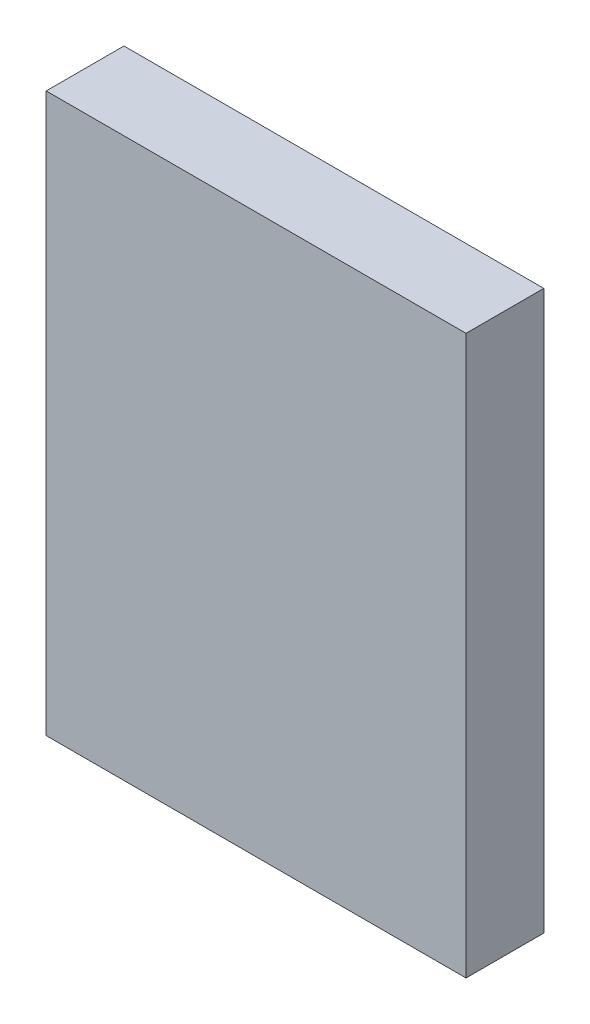
ISO-10303-21;
HEADER;
FILE_DESCRIPTION(('STEP AP214'),'2;1');
FILE_NAME('part.step','',(''),(''),'','','');
FILE_SCHEMA(('AUTOMOTIVE_DESIGN { 1 0 10303 214 1 1 1 1 }'));
ENDSEC;
DATA;
#1=APPLICATION_CONTEXT('core data for automotive mechanical design processes');
#2=APPLICATION_PROTOCOL_DEFINITION('international standard','automotive_design',2000,#1);
#3=PRODUCT_CONTEXT('',#1,'mechanical');
#4=PRODUCT('Part','Part','',(#3));
#5=PRODUCT_RELATED_PRODUCT_CATEGORY('part','',(#4));
#6=PRODUCT_DEFINITION_FORMATION('','',#4);
#7=PRODUCT_DEFINITION_CONTEXT('part definition',#1,'design');
#8=PRODUCT_DEFINITION('design','',#6,#7);
#9=PRODUCT_DEFINITION_SHAPE('','',#8);
#10=(LENGTH_UNIT() NAMED_UNIT(*) SI_UNIT(.MILLI.,.METRE.));
#11=(NAMED_UNIT(*) PLANE_ANGLE_UNIT() SI_UNIT($,.RADIAN.));
#12=(NAMED_UNIT(*) SI_UNIT($,.STERADIAN.) SOLID_ANGLE_UNIT());
#13=UNCERTAINTY_MEASURE_WITH_UNIT(LENGTH_MEASURE(1.E-05),#10,'distance_accuracy_value','');
#14=(GEOMETRIC_REPRESENTATION_CONTEXT(3) GLOBAL_UNCERTAINTY_ASSIGNED_CONTEXT((#13)) GLOBAL_UNIT_ASSIGNED_CONTEXT((#10,
#11,#12)) REPRESENTATION_CONTEXT('',''));
#15=CARTESIAN_POINT('',(0.,0.,0.));
#16=DIRECTION('',(0.,0.,1.));
#17=DIRECTION('',(1.,0.,0.));
#18=AXIS2_PLACEMENT_3D('',#15,#16,#17);
#19=CARTESIAN_POINT('',(179.309527428535,-7.03255892249707E-13,15.));
#20=DIRECTION('',(1.,0.,0.));
#21=DIRECTION('',(0.,1.,0.));
#22=AXIS2_PLACEMENT_3D('',#19,#20,#21);
#23=PLANE('',#22);
#24=DIRECTION('',(0.,0.,-1.));
#25=VECTOR('',#24,1.);
#26=CARTESIAN_POINT('',(179.309527428536,42.3848722358489,2.));
#27=LINE('',#26,#25);
#28=CARTESIAN_POINT('',(179.309527428536,42.3848722358489,2.));
#29=VERTEX_POINT('',#28);
#30=CARTESIAN_POINT('',(179.309527428536,42.3848722358489,0.));
#31=VERTEX_POINT('',#30);
#32=EDGE_CURVE('E232',#29,#31,#27,.T.);
#33=ORIENTED_EDGE('',*,*,#32,.F.);
#34=DIRECTION('',(0.,-1.,0.));
#35=VECTOR('',#34,1.);
#36=CARTESIAN_POINT('',(179.309527428536,42.3848722358489,2.));
#37=LINE('',#36,#35);
#38=CARTESIAN_POINT('',(179.309527428536,29.8619960553377,2.));
#39=VERTEX_POINT('',#38);
#40=EDGE_CURVE('E388',#29,#39,#37,.T.);
#41=ORIENTED_EDGE('',*,*,#40,.T.);
#42=DIRECTION('',(0.,0.,-1.));
#43=VECTOR('',#42,1.);
#44=CARTESIAN_POINT('',(179.309527428536,29.8619960553377,15.));
#45=LINE('',#44,#43);
#46=CARTESIAN_POINT('',(179.309527428536,29.8619960553377,15.));
#47=VERTEX_POINT('',#46);
#48=EDGE_CURVE('E286',#47,#39,#45,.T.);
#49=ORIENTED_EDGE('',*,*,#48,.F.);
#50=DIRECTION('',(0.,-1.,0.));
#51=VECTOR('',#50,1.);
#52=CARTESIAN_POINT('',(179.309527428535,-7.03255892249707E-13,15.));
#53=LINE('',#52,#51);
#54=CARTESIAN_POINT('',(179.309527428536,151.036037203411,15.));
#55=VERTEX_POINT('',#54);
#56=EDGE_CURVE('E270',#55,#47,#53,.T.);
#57=ORIENTED_EDGE('',*,*,#56,.F.);
#58=DIRECTION('',(0.,0.,-1.));
#59=VECTOR('',#58,1.);
#60=CARTESIAN_POINT('',(179.309527428536,151.036037203411,15.));
#61=LINE('',#60,#59);
#62=CARTESIAN_POINT('',(179.309527428536,151.036037203411,0.));
#63=VERTEX_POINT('',#62);
#64=EDGE_CURVE('E271',#55,#63,#61,.T.);
#65=ORIENTED_EDGE('',*,*,#64,.T.);
#66=DIRECTION('',(0.,-1.,0.));
#67=VECTOR('',#66,1.);
#68=CARTESIAN_POINT('',(179.309527428535,-7.03255892249707E-13,0.));
#69=LINE('',#68,#67);
#70=CARTESIAN_POINT('',(179.309527428536,100.884872235849,0.));
#71=VERTEX_POINT('',#70);
#72=EDGE_CURVE('E261',#63,#71,#69,.T.);
#73=ORIENTED_EDGE('',*,*,#72,.T.);
#74=DIRECTION('',(0.,0.,-1.));
#75=VECTOR('',#74,1.);
#76=CARTESIAN_POINT('',(179.309527428536,100.884872235849,2.));
#77=LINE('',#76,#75);
#78=CARTESIAN_POINT('',(179.309527428536,100.884872235849,2.));
#79=VERTEX_POINT('',#78);
#80=EDGE_CURVE('E429',#79,#71,#77,.T.);
#81=ORIENTED_EDGE('',*,*,#80,.F.);
#82=DIRECTION('',(0.,-1.,0.));
#83=VECTOR('',#82,1.);
#84=CARTESIAN_POINT('',(179.309527428536,100.884872235849,2.));
#85=LINE('',#84,#83);
#86=CARTESIAN_POINT('',(179.309527428536,75.8848722358489,2.));
#87=VERTEX_POINT('',#86);
#88=EDGE_CURVE('E399',#79,#87,#85,.T.);
#89=ORIENTED_EDGE('',*,*,#88,.T.);
#90=DIRECTION('',(0.,0.,-1.));
#91=VECTOR('',#90,1.);
#92=CARTESIAN_POINT('',(179.309527428536,75.8848722358489,2.));
#93=LINE('',#92,#91);
#94=CARTESIAN_POINT('',(179.309527428536,75.8848722358489,0.));
#95=VERTEX_POINT('',#94);
#96=EDGE_CURVE('E425',#87,#95,#93,.T.);
#97=ORIENTED_EDGE('',*,*,#96,.T.);
#98=EDGE_CURVE('E498',#95,#31,#69,.T.);
#99=ORIENTED_EDGE('',*,*,#98,.T.);
#100=EDGE_LOOP('',(#33,#41,#49,#57,#65,#73,#81,#89,#97,#99));
#101=FACE_BOUND('',#100,.T.);
#102=ADVANCED_FACE('F45',(#101),#23,.F.);
#103=CARTESIAN_POINT('',(102.160177428536,0.,15.));
#104=DIRECTION('',(1.,0.,0.));
#105=DIRECTION('',(0.,0.,-1.));
#106=AXIS2_PLACEMENT_3D('',#103,#104,#105);
#107=PLANE('',#106);
#108=DIRECTION('',(0.,1.,0.));
#109=VECTOR('',#108,1.);
#110=CARTESIAN_POINT('',(102.160177428536,100.884872235849,2.));
#111=LINE('',#110,#109);
#112=CARTESIAN_POINT('',(102.160177428536,75.8848722358489,2.));
#113=VERTEX_POINT('',#112);
#114=CARTESIAN_POINT('',(102.160177428536,100.884872235849,2.));
#115=VERTEX_POINT('',#114);
#116=EDGE_CURVE('E355',#113,#115,#111,.T.);
#117=ORIENTED_EDGE('',*,*,#116,.T.);
#118=DIRECTION('',(0.,0.,-1.));
#119=VECTOR('',#118,1.);
#120=CARTESIAN_POINT('',(102.160177428536,100.884872235849,2.));
#121=LINE('',#120,#119);
#122=CARTESIAN_POINT('',(102.160177428536,100.884872235849,0.));
#123=VERTEX_POINT('',#122);
#124=EDGE_CURVE('E351',#115,#123,#121,.T.);
#125=ORIENTED_EDGE('',*,*,#124,.T.);
#126=DIRECTION('',(0.,-1.,0.));
#127=VECTOR('',#126,1.);
#128=CARTESIAN_POINT('',(102.160177428536,0.,0.));
#129=LINE('',#128,#127);
#130=CARTESIAN_POINT('',(102.160177428536,126.061456055338,0.));
#131=VERTEX_POINT('',#130);
#132=EDGE_CURVE('E253',#131,#123,#129,.T.);
#133=ORIENTED_EDGE('',*,*,#132,.F.);
#134=DIRECTION('',(0.,0.,-1.));
#135=VECTOR('',#134,1.);
#136=CARTESIAN_POINT('',(102.160177428536,126.061456055338,15.));
#137=LINE('',#136,#135);
#138=CARTESIAN_POINT('',(102.160177428536,126.061456055338,15.));
#139=VERTEX_POINT('',#138);
#140=EDGE_CURVE('E280',#139,#131,#137,.T.);
#141=ORIENTED_EDGE('',*,*,#140,.F.);
#142=DIRECTION('',(0.,-1.,0.));
#143=VECTOR('',#142,1.);
#144=CARTESIAN_POINT('',(102.160177428536,0.,15.));
#145=LINE('',#144,#143);
#146=CARTESIAN_POINT('',(102.160177428536,29.8619960553377,15.));
#147=VERTEX_POINT('',#146);
#148=EDGE_CURVE('E474',#139,#147,#145,.T.);
#149=ORIENTED_EDGE('',*,*,#148,.T.);
#150=DIRECTION('',(0.,0.,-1.));
#151=VECTOR('',#150,1.);
#152=CARTESIAN_POINT('',(102.160177428536,29.8619960553377,15.));
#153=LINE('',#152,#151);
#154=CARTESIAN_POINT('',(102.160177428536,29.8619960553377,2.));
#155=VERTEX_POINT('',#154);
#156=EDGE_CURVE('E283',#147,#155,#153,.T.);
#157=ORIENTED_EDGE('',*,*,#156,.T.);
#158=DIRECTION('',(0.,1.,0.));
#159=VECTOR('',#158,1.);
#160=CARTESIAN_POINT('',(102.160177428536,42.3848722358489,2.));
#161=LINE('',#160,#159);
#162=CARTESIAN_POINT('',(102.160177428536,42.3848722358489,2.));
#163=VERTEX_POINT('',#162);
#164=EDGE_CURVE('E243',#155,#163,#161,.T.);
#165=ORIENTED_EDGE('',*,*,#164,.T.);
#166=DIRECTION('',(0.,0.,-1.));
#167=VECTOR('',#166,1.);
#168=CARTESIAN_POINT('',(102.160177428536,42.3848722358489,2.));
#169=LINE('',#168,#167);
#170=CARTESIAN_POINT('',(102.160177428536,42.3848722358489,0.));
#171=VERTEX_POINT('',#170);
#172=EDGE_CURVE('E224',#163,#171,#169,.T.);
#173=ORIENTED_EDGE('',*,*,#172,.T.);
#174=CARTESIAN_POINT('',(102.160177428536,75.8848722358489,0.));
#175=VERTEX_POINT('',#174);
#176=EDGE_CURVE('E241',#175,#171,#129,.T.);
#177=ORIENTED_EDGE('',*,*,#176,.F.);
#178=DIRECTION('',(0.,0.,-1.));
#179=VECTOR('',#178,1.);
#180=CARTESIAN_POINT('',(102.160177428536,75.8848722358489,2.));
#181=LINE('',#180,#179);
#182=EDGE_CURVE('E348',#113,#175,#181,.T.);
#183=ORIENTED_EDGE('',*,*,#182,.F.);
#184=EDGE_LOOP('',(#117,#125,#133,#141,#149,#157,#165,#173,#177,#183));
#185=FACE_BOUND('',#184,.T.);
#186=ADVANCED_FACE('F239',(#185),#107,.T.);
#187=CARTESIAN_POINT('',(0.,26.8619960553377,15.));
#188=DIRECTION('',(0.,1.,0.));
#189=DIRECTION('',(0.,0.,1.));
#190=AXIS2_PLACEMENT_3D('',#187,#188,#189);
#191=PLANE('',#190);
#192=DIRECTION('',(0.,0.,-1.));
#193=VECTOR('',#192,1.);
#194=CARTESIAN_POINT('',(179.309527428536,26.8619960553377,15.));
#195=LINE('',#194,#193);
#196=CARTESIAN_POINT('',(179.309527428536,26.8619960553377,2.));
#197=VERTEX_POINT('',#196);
#198=CARTESIAN_POINT('',(179.309527428536,26.8619960553377,0.));
#199=VERTEX_POINT('',#198);
#200=EDGE_CURVE('E443',#197,#199,#195,.T.);
#201=ORIENTED_EDGE('',*,*,#200,.F.);
#202=DIRECTION('',(-1.,0.,0.));
#203=VECTOR('',#202,1.);
#204=CARTESIAN_POINT('',(0.,26.8619960553377,2.));
#205=LINE('',#204,#203);
#206=CARTESIAN_POINT('',(187.309527428536,26.8619960553377,2.));
#207=VERTEX_POINT('',#206);
#208=EDGE_CURVE('E11',#207,#197,#205,.T.);
#209=ORIENTED_EDGE('',*,*,#208,.F.);
#210=DIRECTION('',(0.,0.,1.));
#211=VECTOR('',#210,1.);
#212=CARTESIAN_POINT('',(187.309527428536,26.8619960553377,15.));
#213=LINE('',#212,#211);
#214=CARTESIAN_POINT('',(187.309527428536,26.8619960553377,0.));
#215=VERTEX_POINT('',#214);
#216=EDGE_CURVE('E440',#215,#207,#213,.T.);
#217=ORIENTED_EDGE('',*,*,#216,.F.);
#218=DIRECTION('',(1.,0.,0.));
#219=VECTOR('',#218,1.);
#220=CARTESIAN_POINT('',(0.,26.8619960553377,0.));
#221=LINE('',#220,#219);
#222=CARTESIAN_POINT('',(189.309527428536,26.8619960553377,0.));
#223=VERTEX_POINT('',#222);
#224=EDGE_CURVE('E495',#215,#223,#221,.T.);
#225=ORIENTED_EDGE('',*,*,#224,.T.);
#226=DIRECTION('',(0.,0.,-1.));
#227=VECTOR('',#226,1.);
#228=CARTESIAN_POINT('',(189.309527428536,26.8619960553377,15.));
#229=LINE('',#228,#227);
#230=CARTESIAN_POINT('',(189.309527428536,26.8619960553377,18.));
#231=VERTEX_POINT('',#230);
#232=EDGE_CURVE('E291',#231,#223,#229,.T.);
#233=ORIENTED_EDGE('',*,*,#232,.F.);
#234=DIRECTION('',(1.,0.,0.));
#235=VECTOR('',#234,1.);
#236=CARTESIAN_POINT('',(92.1601774285358,26.8619960553377,18.));
#237=LINE('',#236,#235);
#238=CARTESIAN_POINT('',(92.1601774285358,26.8619960553377,18.));
#239=VERTEX_POINT('',#238);
#240=EDGE_CURVE('E454',#239,#231,#237,.T.);
#241=ORIENTED_EDGE('',*,*,#240,.F.);
#242=DIRECTION('',(0.,0.,-1.));
#243=VECTOR('',#242,1.);
#244=CARTESIAN_POINT('',(92.1601774285358,26.8619960553377,15.));
#245=LINE('',#244,#243);
#246=CARTESIAN_POINT('',(92.1601774285358,26.8619960553377,0.));
#247=VERTEX_POINT('',#246);
#248=EDGE_CURVE('E295',#239,#247,#245,.T.);
#249=ORIENTED_EDGE('',*,*,#248,.T.);
#250=CARTESIAN_POINT('',(94.1601774285357,26.8619960553377,0.));
#251=VERTEX_POINT('',#250);
#252=EDGE_CURVE('E496',#247,#251,#221,.T.);
#253=ORIENTED_EDGE('',*,*,#252,.T.);
#254=DIRECTION('',(0.,0.,-1.));
#255=VECTOR('',#254,1.);
#256=CARTESIAN_POINT('',(94.1601774285357,26.8619960553377,15.));
#257=LINE('',#256,#255);
#258=CARTESIAN_POINT('',(94.1601774285357,26.8619960553377,2.));
#259=VERTEX_POINT('',#258);
#260=EDGE_CURVE('E323',#259,#251,#257,.T.);
#261=ORIENTED_EDGE('',*,*,#260,.F.);
#262=DIRECTION('',(1.,0.,0.));
#263=VECTOR('',#262,1.);
#264=CARTESIAN_POINT('',(0.,26.8619960553377,2.));
#265=LINE('',#264,#263);
#266=CARTESIAN_POINT('',(102.160177428536,26.8619960553377,2.));
#267=VERTEX_POINT('',#266);
#268=EDGE_CURVE('E54',#259,#267,#265,.T.);
#269=ORIENTED_EDGE('',*,*,#268,.T.);
#270=DIRECTION('',(0.,0.,1.));
#271=VECTOR('',#270,1.);
#272=CARTESIAN_POINT('',(102.160177428536,26.8619960553377,15.));
#273=LINE('',#272,#271);
#274=CARTESIAN_POINT('',(102.160177428536,26.8619960553377,0.));
#275=VERTEX_POINT('',#274);
#276=EDGE_CURVE('E320',#275,#267,#273,.T.);
#277=ORIENTED_EDGE('',*,*,#276,.F.);
#278=EDGE_CURVE('E499',#275,#199,#221,.T.);
#279=ORIENTED_EDGE('',*,*,#278,.T.);
#280=EDGE_LOOP('',(#201,#209,#217,#225,#233,#241,#249,#253,#261,#269,#277,#279));
#281=FACE_BOUND('',#280,.T.);
#282=ADVANCED_FACE('F318',(#281),#191,.F.);
#283=CARTESIAN_POINT('',(0.,0.,0.));
#284=DIRECTION('',(0.,0.,1.));
#285=DIRECTION('',(1.,0.,0.));
#286=AXIS2_PLACEMENT_3D('',#283,#284,#285);
#287=PLANE('',#286);
#288=DIRECTION('',(-1.,0.,0.));
#289=VECTOR('',#288,1.);
#290=CARTESIAN_POINT('',(102.160177428536,100.884872235849,0.));
#291=LINE('',#290,#289);
#292=CARTESIAN_POINT('',(94.1601774285357,100.884872235849,0.));
#293=VERTEX_POINT('',#292);
#294=EDGE_CURVE('E362',#123,#293,#291,.T.);
#295=ORIENTED_EDGE('',*,*,#294,.T.);
#296=DIRECTION('',(0.,-1.,0.));
#297=VECTOR('',#296,1.);
#298=CARTESIAN_POINT('',(94.1601774285357,100.884872235849,0.));
#299=LINE('',#298,#297);
#300=CARTESIAN_POINT('',(94.1601774285357,75.8848722358489,0.));
#301=VERTEX_POINT('',#300);
#302=EDGE_CURVE('E358',#293,#301,#299,.T.);
#303=ORIENTED_EDGE('',*,*,#302,.T.);
#304=DIRECTION('',(1.,0.,0.));
#305=VECTOR('',#304,1.);
#306=CARTESIAN_POINT('',(102.160177428536,75.8848722358489,0.));
#307=LINE('',#306,#305);
#308=EDGE_CURVE('E251',#301,#175,#307,.T.);
#309=ORIENTED_EDGE('',*,*,#308,.T.);
#310=ORIENTED_EDGE('',*,*,#176,.T.);
#311=DIRECTION('',(-1.,0.,0.));
#312=VECTOR('',#311,1.);
#313=CARTESIAN_POINT('',(102.160177428536,42.3848722358489,0.));
#314=LINE('',#313,#312);
#315=CARTESIAN_POINT('',(94.1601774285357,42.3848722358489,0.));
#316=VERTEX_POINT('',#315);
#317=EDGE_CURVE('E220',#171,#316,#314,.T.);
#318=ORIENTED_EDGE('',*,*,#317,.T.);
#319=DIRECTION('',(0.,-1.,0.));
#320=VECTOR('',#319,1.);
#321=CARTESIAN_POINT('',(94.1601774285357,42.3848722358489,0.));
#322=LINE('',#321,#320);
#323=EDGE_CURVE('E233',#316,#251,#322,.T.);
#324=ORIENTED_EDGE('',*,*,#323,.T.);
#325=ORIENTED_EDGE('',*,*,#252,.F.);
#326=DIRECTION('',(0.,-1.,0.));
#327=VECTOR('',#326,1.);
#328=CARTESIAN_POINT('',(92.1601774285358,0.,0.));
#329=LINE('',#328,#327);
#330=CARTESIAN_POINT('',(92.1601774285357,156.061456055338,0.));
#331=VERTEX_POINT('',#330);
#332=EDGE_CURVE('E492',#331,#247,#329,.T.);
#333=ORIENTED_EDGE('',*,*,#332,.F.);
#334=DIRECTION('',(1.,0.,0.));
#335=VECTOR('',#334,1.);
#336=CARTESIAN_POINT('',(0.,156.061456055338,0.));
#337=LINE('',#336,#335);
#338=CARTESIAN_POINT('',(189.309527428536,156.061456055338,0.));
#339=VERTEX_POINT('',#338);
#340=EDGE_CURVE('E488',#331,#339,#337,.T.);
#341=ORIENTED_EDGE('',*,*,#340,.T.);
#342=DIRECTION('',(0.,-1.,0.));
#343=VECTOR('',#342,1.);
#344=CARTESIAN_POINT('',(189.309527428536,0.,0.));
#345=LINE('',#344,#343);
#346=EDGE_CURVE('E466',#339,#223,#345,.T.);
#347=ORIENTED_EDGE('',*,*,#346,.T.);
#348=ORIENTED_EDGE('',*,*,#224,.F.);
#349=DIRECTION('',(0.,-1.,0.));
#350=VECTOR('',#349,1.);
#351=CARTESIAN_POINT('',(187.309527428536,0.,0.));
#352=LINE('',#351,#350);
#353=CARTESIAN_POINT('',(187.309527428536,42.3848722358489,0.));
#354=VERTEX_POINT('',#353);
#355=EDGE_CURVE('E307',#354,#215,#352,.T.);
#356=ORIENTED_EDGE('',*,*,#355,.F.);
#357=DIRECTION('',(-1.,0.,0.));
#358=VECTOR('',#357,1.);
#359=CARTESIAN_POINT('',(179.309527428536,42.3848722358489,0.));
#360=LINE('',#359,#358);
#361=EDGE_CURVE('E61',#354,#31,#360,.T.);
#362=ORIENTED_EDGE('',*,*,#361,.T.);
#363=ORIENTED_EDGE('',*,*,#98,.F.);
#364=DIRECTION('',(1.,0.,0.));
#365=VECTOR('',#364,1.);
#366=CARTESIAN_POINT('',(179.309527428536,75.8848722358489,0.));
#367=LINE('',#366,#365);
#368=CARTESIAN_POINT('',(187.309527428536,75.8848722358489,0.));
#369=VERTEX_POINT('',#368);
#370=EDGE_CURVE('E413',#95,#369,#367,.T.);
#371=ORIENTED_EDGE('',*,*,#370,.T.);
#372=DIRECTION('',(0.,1.,0.));
#373=VECTOR('',#372,1.);
#374=CARTESIAN_POINT('',(187.309527428536,100.884872235849,0.));
#375=LINE('',#374,#373);
#376=CARTESIAN_POINT('',(187.309527428536,100.884872235849,0.));
#377=VERTEX_POINT('',#376);
#378=EDGE_CURVE('E400',#369,#377,#375,.T.);
#379=ORIENTED_EDGE('',*,*,#378,.T.);
#380=DIRECTION('',(-1.,0.,0.));
#381=VECTOR('',#380,1.);
#382=CARTESIAN_POINT('',(179.309527428536,100.884872235849,0.));
#383=LINE('',#382,#381);
#384=EDGE_CURVE('E69',#377,#71,#383,.T.);
#385=ORIENTED_EDGE('',*,*,#384,.T.);
#386=ORIENTED_EDGE('',*,*,#72,.F.);
#387=DIRECTION('',(1.,0.,0.));
#388=VECTOR('',#387,1.);
#389=CARTESIAN_POINT('',(1.08710511562201E-13,151.036037203411,0.));
#390=LINE('',#389,#388);
#391=CARTESIAN_POINT('',(102.185575180632,151.036037203411,0.));
#392=VERTEX_POINT('',#391);
#393=EDGE_CURVE('E267',#392,#63,#390,.T.);
#394=ORIENTED_EDGE('',*,*,#393,.F.);
#395=DIRECTION('',(0.00101694354001441,0.999999482912785,0.));
#396=VECTOR('',#395,1.);
#397=CARTESIAN_POINT('',(102.031874460029,-0.103760709261023,0.));
#398=LINE('',#397,#396);
#399=EDGE_CURVE('E259',#131,#392,#398,.T.);
#400=ORIENTED_EDGE('',*,*,#399,.F.);
#401=ORIENTED_EDGE('',*,*,#132,.T.);
#402=EDGE_LOOP('',(#295,#303,#309,#310,#318,#324,#325,#333,#341,#347,#348,#356,#362,#363,#371,
#379,#385,#386,#394,#400,#401));
#403=FACE_BOUND('',#402,.T.);
#404=ADVANCED_FACE('F248',(#403),#287,.F.);
#405=DIRECTION('',(0.,1.,0.));
#406=VECTOR('',#405,1.);
#407=CARTESIAN_POINT('',(179.309527428535,-7.96294263543264E-13,0.));
#408=LINE('',#407,#406);
#409=CARTESIAN_POINT('',(179.309527428536,29.8619960553377,0.));
#410=VERTEX_POINT('',#409);
#411=EDGE_CURVE('E310',#199,#410,#408,.T.);
#412=ORIENTED_EDGE('',*,*,#411,.F.);
#413=ORIENTED_EDGE('',*,*,#278,.F.);
#414=DIRECTION('',(0.,-1.,0.));
#415=VECTOR('',#414,1.);
#416=CARTESIAN_POINT('',(102.160177428536,4.53682324723806E-13,0.));
#417=LINE('',#416,#415);
#418=CARTESIAN_POINT('',(102.160177428536,29.8619960553377,0.));
#419=VERTEX_POINT('',#418);
#420=EDGE_CURVE('E290',#419,#275,#417,.T.);
#421=ORIENTED_EDGE('',*,*,#420,.F.);
#422=DIRECTION('',(1.,0.,0.));
#423=VECTOR('',#422,1.);
#424=CARTESIAN_POINT('',(0.,29.8619960553378,0.));
#425=LINE('',#424,#423);
#426=EDGE_CURVE('E254',#419,#410,#425,.T.);
#427=ORIENTED_EDGE('',*,*,#426,.T.);
#428=EDGE_LOOP('',(#412,#413,#421,#427));
#429=FACE_BOUND('',#428,.T.);
#430=ADVANCED_FACE('F583',(#429),#287,.F.);
#431=CARTESIAN_POINT('',(0.,29.8619960553378,15.));
#432=DIRECTION('',(0.,1.,0.));
#433=DIRECTION('',(-1.,0.,0.));
#434=AXIS2_PLACEMENT_3D('',#431,#432,#433);
#435=PLANE('',#434);
#436=ORIENTED_EDGE('',*,*,#426,.F.);
#437=DIRECTION('',(0.,0.,1.));
#438=VECTOR('',#437,1.);
#439=CARTESIAN_POINT('',(102.160177428536,29.8619960553377,15.));
#440=LINE('',#439,#438);
#441=EDGE_CURVE('E434',#419,#155,#440,.T.);
#442=ORIENTED_EDGE('',*,*,#441,.T.);
#443=ORIENTED_EDGE('',*,*,#156,.F.);
#444=DIRECTION('',(1.,0.,0.));
#445=VECTOR('',#444,1.);
#446=CARTESIAN_POINT('',(0.,29.8619960553378,15.));
#447=LINE('',#446,#445);
#448=EDGE_CURVE('E470',#147,#47,#447,.T.);
#449=ORIENTED_EDGE('',*,*,#448,.T.);
#450=ORIENTED_EDGE('',*,*,#48,.T.);
#451=DIRECTION('',(0.,0.,-1.));
#452=VECTOR('',#451,1.);
#453=CARTESIAN_POINT('',(179.309527428536,29.8619960553377,15.));
#454=LINE('',#453,#452);
#455=EDGE_CURVE('E446',#39,#410,#454,.T.);
#456=ORIENTED_EDGE('',*,*,#455,.T.);
#457=EDGE_LOOP('',(#436,#442,#443,#449,#450,#456));
#458=FACE_BOUND('',#457,.T.);
#459=ADVANCED_FACE('F566',(#458),#435,.T.);
#460=CARTESIAN_POINT('',(102.031874460029,-0.103760709261023,15.));
#461=DIRECTION('',(-0.999999482912785,0.00101694354001441,0.));
#462=DIRECTION('',(-0.00101694354001441,-0.999999482912785,0.));
#463=AXIS2_PLACEMENT_3D('',#460,#461,#462);
#464=PLANE('',#463);
#465=ORIENTED_EDGE('',*,*,#399,.T.);
#466=DIRECTION('',(0.,0.,-1.));
#467=VECTOR('',#466,1.);
#468=CARTESIAN_POINT('',(102.185575180632,151.036037203411,15.));
#469=LINE('',#468,#467);
#470=CARTESIAN_POINT('',(102.185575180632,151.036037203411,15.));
#471=VERTEX_POINT('',#470);
#472=EDGE_CURVE('E275',#471,#392,#469,.T.);
#473=ORIENTED_EDGE('',*,*,#472,.F.);
#474=DIRECTION('',(0.00101694354001441,0.999999482912785,0.));
#475=VECTOR('',#474,1.);
#476=CARTESIAN_POINT('',(102.031874460029,-0.103760709261023,15.));
#477=LINE('',#476,#475);
#478=EDGE_CURVE('E478',#139,#471,#477,.T.);
#479=ORIENTED_EDGE('',*,*,#478,.F.);
#480=ORIENTED_EDGE('',*,*,#140,.T.);
#481=EDGE_LOOP('',(#465,#473,#479,#480));
#482=FACE_BOUND('',#481,.T.);
#483=ADVANCED_FACE('F574',(#482),#464,.F.);
#484=CARTESIAN_POINT('',(189.309527428536,0.,15.));
#485=DIRECTION('',(1.,0.,0.));
#486=DIRECTION('',(0.,0.,-1.));
#487=AXIS2_PLACEMENT_3D('',#484,#485,#486);
#488=PLANE('',#487);
#489=ORIENTED_EDGE('',*,*,#346,.F.);
#490=DIRECTION('',(0.,0.,-1.));
#491=VECTOR('',#490,1.);
#492=CARTESIAN_POINT('',(189.309527428536,156.061456055338,15.));
#493=LINE('',#492,#491);
#494=CARTESIAN_POINT('',(189.309527428536,156.061456055338,18.));
#495=VERTEX_POINT('',#494);
#496=EDGE_CURVE('E276',#495,#339,#493,.T.);
#497=ORIENTED_EDGE('',*,*,#496,.F.);
#498=DIRECTION('',(0.,1.,0.));
#499=VECTOR('',#498,1.);
#500=CARTESIAN_POINT('',(189.309527428536,156.061456055338,18.));
#501=LINE('',#500,#499);
#502=EDGE_CURVE('E458',#231,#495,#501,.T.);
#503=ORIENTED_EDGE('',*,*,#502,.F.);
#504=ORIENTED_EDGE('',*,*,#232,.T.);
#505=EDGE_LOOP('',(#489,#497,#503,#504));
#506=FACE_BOUND('',#505,.T.);
#507=ADVANCED_FACE('F47',(#506),#488,.T.);
#508=CARTESIAN_POINT('',(0.,156.061456055338,15.));
#509=DIRECTION('',(0.,1.,0.));
#510=DIRECTION('',(0.,0.,1.));
#511=AXIS2_PLACEMENT_3D('',#508,#509,#510);
#512=PLANE('',#511);
#513=ORIENTED_EDGE('',*,*,#340,.F.);
#514=DIRECTION('',(0.,0.,-1.));
#515=VECTOR('',#514,1.);
#516=CARTESIAN_POINT('',(92.1601774285357,156.061456055338,15.));
#517=LINE('',#516,#515);
#518=CARTESIAN_POINT('',(92.1601774285357,156.061456055338,18.));
#519=VERTEX_POINT('',#518);
#520=EDGE_CURVE('E300',#519,#331,#517,.T.);
#521=ORIENTED_EDGE('',*,*,#520,.F.);
#522=DIRECTION('',(-1.,0.,0.));
#523=VECTOR('',#522,1.);
#524=CARTESIAN_POINT('',(92.1601774285357,156.061456055338,18.));
#525=LINE('',#524,#523);
#526=EDGE_CURVE('E462',#495,#519,#525,.T.);
#527=ORIENTED_EDGE('',*,*,#526,.F.);
#528=ORIENTED_EDGE('',*,*,#496,.T.);
#529=EDGE_LOOP('',(#513,#521,#527,#528));
#530=FACE_BOUND('',#529,.T.);
#531=ADVANCED_FACE('F538',(#530),#512,.T.);
#532=CARTESIAN_POINT('',(92.1601774285358,0.,15.));
#533=DIRECTION('',(1.,0.,0.));
#534=DIRECTION('',(0.,1.,0.));
#535=AXIS2_PLACEMENT_3D('',#532,#533,#534);
#536=PLANE('',#535);
#537=ORIENTED_EDGE('',*,*,#332,.T.);
#538=ORIENTED_EDGE('',*,*,#248,.F.);
#539=DIRECTION('',(0.,-1.,0.));
#540=VECTOR('',#539,1.);
#541=CARTESIAN_POINT('',(92.1601774285357,156.061456055338,18.));
#542=LINE('',#541,#540);
#543=EDGE_CURVE('E450',#519,#239,#542,.T.);
#544=ORIENTED_EDGE('',*,*,#543,.F.);
#545=ORIENTED_EDGE('',*,*,#520,.T.);
#546=EDGE_LOOP('',(#537,#538,#544,#545));
#547=FACE_BOUND('',#546,.T.);
#548=ADVANCED_FACE('F535',(#547),#536,.F.);
#549=CARTESIAN_POINT('',(1.08710511562201E-13,151.036037203411,15.));
#550=DIRECTION('',(0.,1.,0.));
#551=DIRECTION('',(-1.,0.,0.));
#552=AXIS2_PLACEMENT_3D('',#549,#550,#551);
#553=PLANE('',#552);
#554=ORIENTED_EDGE('',*,*,#393,.T.);
#555=ORIENTED_EDGE('',*,*,#64,.F.);
#556=DIRECTION('',(1.,0.,0.));
#557=VECTOR('',#556,1.);
#558=CARTESIAN_POINT('',(1.08710511562201E-13,151.036037203411,15.));
#559=LINE('',#558,#557);
#560=EDGE_CURVE('E296',#471,#55,#559,.T.);
#561=ORIENTED_EDGE('',*,*,#560,.F.);
#562=ORIENTED_EDGE('',*,*,#472,.T.);
#563=EDGE_LOOP('',(#554,#555,#561,#562));
#564=FACE_BOUND('',#563,.T.);
#565=ADVANCED_FACE('F555',(#564),#553,.F.);
#566=CARTESIAN_POINT('',(0.,0.,15.));
#567=DIRECTION('',(0.,0.,1.));
#568=DIRECTION('',(1.,0.,0.));
#569=AXIS2_PLACEMENT_3D('',#566,#567,#568);
#570=PLANE('',#569);
#571=ORIENTED_EDGE('',*,*,#560,.T.);
#572=ORIENTED_EDGE('',*,*,#56,.T.);
#573=ORIENTED_EDGE('',*,*,#448,.F.);
#574=ORIENTED_EDGE('',*,*,#148,.F.);
#575=ORIENTED_EDGE('',*,*,#478,.T.);
#576=EDGE_LOOP('',(#571,#572,#573,#574,#575));
#577=FACE_BOUND('',#576,.T.);
#578=ADVANCED_FACE('F547',(#577),#570,.F.);
#579=CARTESIAN_POINT('',(0.,0.,18.));
#580=DIRECTION('',(0.,0.,1.));
#581=DIRECTION('',(1.,0.,0.));
#582=AXIS2_PLACEMENT_3D('',#579,#580,#581);
#583=PLANE('',#582);
#584=ORIENTED_EDGE('',*,*,#543,.T.);
#585=ORIENTED_EDGE('',*,*,#240,.T.);
#586=ORIENTED_EDGE('',*,*,#502,.T.);
#587=ORIENTED_EDGE('',*,*,#526,.T.);
#588=EDGE_LOOP('',(#584,#585,#586,#587));
#589=FACE_BOUND('',#588,.T.);
#590=ADVANCED_FACE('F544',(#589),#583,.T.);
#591=CARTESIAN_POINT('',(179.309527428536,100.884872235849,2.));
#592=DIRECTION('',(0.,-1.,0.));
#593=DIRECTION('',(0.,0.,-1.));
#594=AXIS2_PLACEMENT_3D('',#591,#592,#593);
#595=PLANE('',#594);
#596=ORIENTED_EDGE('',*,*,#384,.F.);
#597=DIRECTION('',(0.,0.,-1.));
#598=VECTOR('',#597,1.);
#599=CARTESIAN_POINT('',(187.309527428536,100.884872235849,2.));
#600=LINE('',#599,#598);
#601=CARTESIAN_POINT('',(187.309527428536,100.884872235849,2.));
#602=VERTEX_POINT('',#601);
#603=EDGE_CURVE('E410',#602,#377,#600,.T.);
#604=ORIENTED_EDGE('',*,*,#603,.F.);
#605=DIRECTION('',(-1.,0.,0.));
#606=VECTOR('',#605,1.);
#607=CARTESIAN_POINT('',(179.309527428536,100.884872235849,2.));
#608=LINE('',#607,#606);
#609=EDGE_CURVE('E395',#602,#79,#608,.T.);
#610=ORIENTED_EDGE('',*,*,#609,.T.);
#611=ORIENTED_EDGE('',*,*,#80,.T.);
#612=EDGE_LOOP('',(#596,#604,#610,#611));
#613=FACE_BOUND('',#612,.T.);
#614=ADVANCED_FACE('F546',(#613),#595,.T.);
#615=CARTESIAN_POINT('',(179.309527428536,75.8848722358489,2.));
#616=DIRECTION('',(0.,1.,0.));
#617=DIRECTION('',(0.,0.,1.));
#618=AXIS2_PLACEMENT_3D('',#615,#616,#617);
#619=PLANE('',#618);
#620=ORIENTED_EDGE('',*,*,#370,.F.);
#621=ORIENTED_EDGE('',*,*,#96,.F.);
#622=DIRECTION('',(1.,0.,0.));
#623=VECTOR('',#622,1.);
#624=CARTESIAN_POINT('',(179.309527428536,75.8848722358489,2.));
#625=LINE('',#624,#623);
#626=CARTESIAN_POINT('',(187.309527428536,75.8848722358489,2.));
#627=VERTEX_POINT('',#626);
#628=EDGE_CURVE('E404',#87,#627,#625,.T.);
#629=ORIENTED_EDGE('',*,*,#628,.T.);
#630=DIRECTION('',(0.,0.,-1.));
#631=VECTOR('',#630,1.);
#632=CARTESIAN_POINT('',(187.309527428536,75.8848722358489,2.));
#633=LINE('',#632,#631);
#634=EDGE_CURVE('E422',#627,#369,#633,.T.);
#635=ORIENTED_EDGE('',*,*,#634,.T.);
#636=EDGE_LOOP('',(#620,#621,#629,#635));
#637=FACE_BOUND('',#636,.T.);
#638=ADVANCED_FACE('F553',(#637),#619,.T.);
#639=CARTESIAN_POINT('',(187.309527428536,100.884872235849,2.));
#640=DIRECTION('',(-1.,0.,0.));
#641=DIRECTION('',(0.,0.,1.));
#642=AXIS2_PLACEMENT_3D('',#639,#640,#641);
#643=PLANE('',#642);
#644=ORIENTED_EDGE('',*,*,#378,.F.);
#645=ORIENTED_EDGE('',*,*,#634,.F.);
#646=DIRECTION('',(0.,1.,0.));
#647=VECTOR('',#646,1.);
#648=CARTESIAN_POINT('',(187.309527428536,100.884872235849,2.));
#649=LINE('',#648,#647);
#650=EDGE_CURVE('E407',#627,#602,#649,.T.);
#651=ORIENTED_EDGE('',*,*,#650,.T.);
#652=ORIENTED_EDGE('',*,*,#603,.T.);
#653=EDGE_LOOP('',(#644,#645,#651,#652));
#654=FACE_BOUND('',#653,.T.);
#655=ADVANCED_FACE('F625',(#654),#643,.T.);
#656=CARTESIAN_POINT('',(0.,0.,2.));
#657=DIRECTION('',(0.,0.,-1.));
#658=DIRECTION('',(-1.,0.,0.));
#659=AXIS2_PLACEMENT_3D('',#656,#657,#658);
#660=PLANE('',#659);
#661=ORIENTED_EDGE('',*,*,#609,.F.);
#662=ORIENTED_EDGE('',*,*,#650,.F.);
#663=ORIENTED_EDGE('',*,*,#628,.F.);
#664=ORIENTED_EDGE('',*,*,#88,.F.);
#665=EDGE_LOOP('',(#661,#662,#663,#664));
#666=FACE_BOUND('',#665,.T.);
#667=ADVANCED_FACE('F622',(#666),#660,.T.);
#668=CARTESIAN_POINT('',(0.,0.,2.));
#669=DIRECTION('',(0.,0.,1.));
#670=DIRECTION('',(1.,0.,0.));
#671=AXIS2_PLACEMENT_3D('',#668,#669,#670);
#672=PLANE('',#671);
#673=DIRECTION('',(0.,-1.,0.));
#674=VECTOR('',#673,1.);
#675=CARTESIAN_POINT('',(94.1601774285357,42.3848722358489,2.));
#676=LINE('',#675,#674);
#677=CARTESIAN_POINT('',(94.1601774285357,42.3848722358489,2.));
#678=VERTEX_POINT('',#677);
#679=EDGE_CURVE('E328',#678,#259,#676,.T.);
#680=ORIENTED_EDGE('',*,*,#679,.F.);
#681=DIRECTION('',(-1.,0.,0.));
#682=VECTOR('',#681,1.);
#683=CARTESIAN_POINT('',(102.160177428536,42.3848722358489,2.));
#684=LINE('',#683,#682);
#685=EDGE_CURVE('E334',#163,#678,#684,.T.);
#686=ORIENTED_EDGE('',*,*,#685,.F.);
#687=ORIENTED_EDGE('',*,*,#164,.F.);
#688=EDGE_CURVE('E330',#267,#155,#161,.T.);
#689=ORIENTED_EDGE('',*,*,#688,.F.);
#690=ORIENTED_EDGE('',*,*,#268,.F.);
#691=EDGE_LOOP('',(#680,#686,#687,#689,#690));
#692=FACE_BOUND('',#691,.T.);
#693=ADVANCED_FACE('F327',(#692),#672,.F.);
#694=CARTESIAN_POINT('',(94.1601774285357,42.3848722358489,2.));
#695=DIRECTION('',(1.,0.,0.));
#696=DIRECTION('',(0.,0.,-1.));
#697=AXIS2_PLACEMENT_3D('',#694,#695,#696);
#698=PLANE('',#697);
#699=ORIENTED_EDGE('',*,*,#260,.T.);
#700=ORIENTED_EDGE('',*,*,#323,.F.);
#701=DIRECTION('',(0.,0.,-1.));
#702=VECTOR('',#701,1.);
#703=CARTESIAN_POINT('',(94.1601774285357,42.3848722358489,2.));
#704=LINE('',#703,#702);
#705=EDGE_CURVE('E227',#678,#316,#704,.T.);
#706=ORIENTED_EDGE('',*,*,#705,.F.);
#707=ORIENTED_EDGE('',*,*,#679,.T.);
#708=EDGE_LOOP('',(#699,#700,#706,#707));
#709=FACE_BOUND('',#708,.T.);
#710=ADVANCED_FACE('F332',(#709),#698,.T.);
#711=CARTESIAN_POINT('',(102.160177428536,42.3848722358489,2.));
#712=DIRECTION('',(-1.,0.,0.));
#713=DIRECTION('',(0.,-1.,0.));
#714=AXIS2_PLACEMENT_3D('',#711,#712,#713);
#715=PLANE('',#714);
#716=ORIENTED_EDGE('',*,*,#420,.T.);
#717=ORIENTED_EDGE('',*,*,#276,.T.);
#718=ORIENTED_EDGE('',*,*,#688,.T.);
#719=ORIENTED_EDGE('',*,*,#441,.F.);
#720=EDGE_LOOP('',(#716,#717,#718,#719));
#721=FACE_BOUND('',#720,.T.);
#722=ADVANCED_FACE('F664',(#721),#715,.T.);
#723=CARTESIAN_POINT('',(102.160177428536,42.3848722358489,2.));
#724=DIRECTION('',(0.,-1.,0.));
#725=DIRECTION('',(1.,0.,0.));
#726=AXIS2_PLACEMENT_3D('',#723,#724,#725);
#727=PLANE('',#726);
#728=ORIENTED_EDGE('',*,*,#317,.F.);
#729=ORIENTED_EDGE('',*,*,#172,.F.);
#730=ORIENTED_EDGE('',*,*,#685,.T.);
#731=ORIENTED_EDGE('',*,*,#705,.T.);
#732=EDGE_LOOP('',(#728,#729,#730,#731));
#733=FACE_BOUND('',#732,.T.);
#734=ADVANCED_FACE('F222',(#733),#727,.T.);
#735=CARTESIAN_POINT('',(0.,0.,2.));
#736=DIRECTION('',(0.,0.,-1.));
#737=DIRECTION('',(-1.,0.,0.));
#738=AXIS2_PLACEMENT_3D('',#735,#736,#737);
#739=PLANE('',#738);
#740=ORIENTED_EDGE('',*,*,#208,.T.);
#741=EDGE_CURVE('E387',#39,#197,#37,.T.);
#742=ORIENTED_EDGE('',*,*,#741,.F.);
#743=ORIENTED_EDGE('',*,*,#40,.F.);
#744=DIRECTION('',(-1.,0.,0.));
#745=VECTOR('',#744,1.);
#746=CARTESIAN_POINT('',(179.309527428536,42.3848722358489,2.));
#747=LINE('',#746,#745);
#748=CARTESIAN_POINT('',(187.309527428536,42.3848722358489,2.));
#749=VERTEX_POINT('',#748);
#750=EDGE_CURVE('E384',#749,#29,#747,.T.);
#751=ORIENTED_EDGE('',*,*,#750,.F.);
#752=DIRECTION('',(0.,1.,0.));
#753=VECTOR('',#752,1.);
#754=CARTESIAN_POINT('',(187.309527428536,42.3848722358489,2.));
#755=LINE('',#754,#753);
#756=EDGE_CURVE('E381',#207,#749,#755,.T.);
#757=ORIENTED_EDGE('',*,*,#756,.F.);
#758=EDGE_LOOP('',(#740,#742,#743,#751,#757));
#759=FACE_BOUND('',#758,.T.);
#760=ADVANCED_FACE('F519',(#759),#739,.T.);
#761=CARTESIAN_POINT('',(179.309527428536,42.3848722358489,2.));
#762=DIRECTION('',(1.,0.,0.));
#763=DIRECTION('',(0.,1.,0.));
#764=AXIS2_PLACEMENT_3D('',#761,#762,#763);
#765=PLANE('',#764);
#766=ORIENTED_EDGE('',*,*,#741,.T.);
#767=ORIENTED_EDGE('',*,*,#200,.T.);
#768=ORIENTED_EDGE('',*,*,#411,.T.);
#769=ORIENTED_EDGE('',*,*,#455,.F.);
#770=EDGE_LOOP('',(#766,#767,#768,#769));
#771=FACE_BOUND('',#770,.T.);
#772=ADVANCED_FACE('F522',(#771),#765,.T.);
#773=CARTESIAN_POINT('',(187.309527428536,42.3848722358489,2.));
#774=DIRECTION('',(-1.,0.,0.));
#775=DIRECTION('',(0.,0.,1.));
#776=AXIS2_PLACEMENT_3D('',#773,#774,#775);
#777=PLANE('',#776);
#778=ORIENTED_EDGE('',*,*,#216,.T.);
#779=ORIENTED_EDGE('',*,*,#756,.T.);
#780=DIRECTION('',(0.,0.,-1.));
#781=VECTOR('',#780,1.);
#782=CARTESIAN_POINT('',(187.309527428536,42.3848722358489,2.));
#783=LINE('',#782,#781);
#784=EDGE_CURVE('E378',#749,#354,#783,.T.);
#785=ORIENTED_EDGE('',*,*,#784,.T.);
#786=ORIENTED_EDGE('',*,*,#355,.T.);
#787=EDGE_LOOP('',(#778,#779,#785,#786));
#788=FACE_BOUND('',#787,.T.);
#789=ADVANCED_FACE('F513',(#788),#777,.T.);
#790=CARTESIAN_POINT('',(179.309527428536,42.3848722358489,2.));
#791=DIRECTION('',(0.,-1.,0.));
#792=DIRECTION('',(1.,0.,0.));
#793=AXIS2_PLACEMENT_3D('',#790,#791,#792);
#794=PLANE('',#793);
#795=ORIENTED_EDGE('',*,*,#361,.F.);
#796=ORIENTED_EDGE('',*,*,#784,.F.);
#797=ORIENTED_EDGE('',*,*,#750,.T.);
#798=ORIENTED_EDGE('',*,*,#32,.T.);
#799=EDGE_LOOP('',(#795,#796,#797,#798));
#800=FACE_BOUND('',#799,.T.);
#801=ADVANCED_FACE('F602',(#800),#794,.T.);
#802=CARTESIAN_POINT('',(102.160177428536,100.884872235849,2.));
#803=DIRECTION('',(0.,-1.,0.));
#804=DIRECTION('',(0.,0.,-1.));
#805=AXIS2_PLACEMENT_3D('',#802,#803,#804);
#806=PLANE('',#805);
#807=ORIENTED_EDGE('',*,*,#294,.F.);
#808=ORIENTED_EDGE('',*,*,#124,.F.);
#809=DIRECTION('',(-1.,0.,0.));
#810=VECTOR('',#809,1.);
#811=CARTESIAN_POINT('',(102.160177428536,100.884872235849,2.));
#812=LINE('',#811,#810);
#813=CARTESIAN_POINT('',(94.1601774285357,100.884872235849,2.));
#814=VERTEX_POINT('',#813);
#815=EDGE_CURVE('E359',#115,#814,#812,.T.);
#816=ORIENTED_EDGE('',*,*,#815,.T.);
#817=DIRECTION('',(0.,0.,-1.));
#818=VECTOR('',#817,1.);
#819=CARTESIAN_POINT('',(94.1601774285357,100.884872235849,2.));
#820=LINE('',#819,#818);
#821=EDGE_CURVE('E341',#814,#293,#820,.T.);
#822=ORIENTED_EDGE('',*,*,#821,.T.);
#823=EDGE_LOOP('',(#807,#808,#816,#822));
#824=FACE_BOUND('',#823,.T.);
#825=ADVANCED_FACE('F604',(#824),#806,.T.);
#826=CARTESIAN_POINT('',(94.1601774285357,100.884872235849,2.));
#827=DIRECTION('',(1.,0.,0.));
#828=DIRECTION('',(0.,0.,-1.));
#829=AXIS2_PLACEMENT_3D('',#826,#827,#828);
#830=PLANE('',#829);
#831=ORIENTED_EDGE('',*,*,#302,.F.);
#832=ORIENTED_EDGE('',*,*,#821,.F.);
#833=DIRECTION('',(0.,-1.,0.));
#834=VECTOR('',#833,1.);
#835=CARTESIAN_POINT('',(94.1601774285357,100.884872235849,2.));
#836=LINE('',#835,#834);
#837=CARTESIAN_POINT('',(94.1601774285357,75.8848722358489,2.));
#838=VERTEX_POINT('',#837);
#839=EDGE_CURVE('E370',#814,#838,#836,.T.);
#840=ORIENTED_EDGE('',*,*,#839,.T.);
#841=DIRECTION('',(0.,0.,-1.));
#842=VECTOR('',#841,1.);
#843=CARTESIAN_POINT('',(94.1601774285357,75.8848722358489,2.));
#844=LINE('',#843,#842);
#845=EDGE_CURVE('E345',#838,#301,#844,.T.);
#846=ORIENTED_EDGE('',*,*,#845,.T.);
#847=EDGE_LOOP('',(#831,#832,#840,#846));
#848=FACE_BOUND('',#847,.T.);
#849=ADVANCED_FACE('F610',(#848),#830,.T.);
#850=CARTESIAN_POINT('',(102.160177428536,75.8848722358489,2.));
#851=DIRECTION('',(0.,1.,0.));
#852=DIRECTION('',(0.,0.,1.));
#853=AXIS2_PLACEMENT_3D('',#850,#851,#852);
#854=PLANE('',#853);
#855=ORIENTED_EDGE('',*,*,#308,.F.);
#856=ORIENTED_EDGE('',*,*,#845,.F.);
#857=DIRECTION('',(1.,0.,0.));
#858=VECTOR('',#857,1.);
#859=CARTESIAN_POINT('',(102.160177428536,75.8848722358489,2.));
#860=LINE('',#859,#858);
#861=EDGE_CURVE('E367',#838,#113,#860,.T.);
#862=ORIENTED_EDGE('',*,*,#861,.T.);
#863=ORIENTED_EDGE('',*,*,#182,.T.);
#864=EDGE_LOOP('',(#855,#856,#862,#863));
#865=FACE_BOUND('',#864,.T.);
#866=ADVANCED_FACE('F650',(#865),#854,.T.);
#867=CARTESIAN_POINT('',(0.,0.,2.));
#868=DIRECTION('',(0.,0.,1.));
#869=DIRECTION('',(1.,0.,0.));
#870=AXIS2_PLACEMENT_3D('',#867,#868,#869);
#871=PLANE('',#870);
#872=ORIENTED_EDGE('',*,*,#815,.F.);
#873=ORIENTED_EDGE('',*,*,#116,.F.);
#874=ORIENTED_EDGE('',*,*,#861,.F.);
#875=ORIENTED_EDGE('',*,*,#839,.F.);
#876=EDGE_LOOP('',(#872,#873,#874,#875));
#877=FACE_BOUND('',#876,.T.);
#878=ADVANCED_FACE('F616',(#877),#871,.F.);
#879=CLOSED_SHELL('',(#102,#186,#282,#404,#430,#459,#483,#507,#531,#548,#565,#578,#590,#614,
#638,#655,#667,#693,#710,#722,#734,#760,#772,#789,#801,#825,#849,#866,#878));
#880=MANIFOLD_SOLID_BREP('B2',#879);
#881=ADVANCED_BREP_SHAPE_REPRESENTATION('',(#18,#880),#14);
#882=SHAPE_DEFINITION_REPRESENTATION(#9,#881);
ENDSEC;
END-ISO-10303-21;
